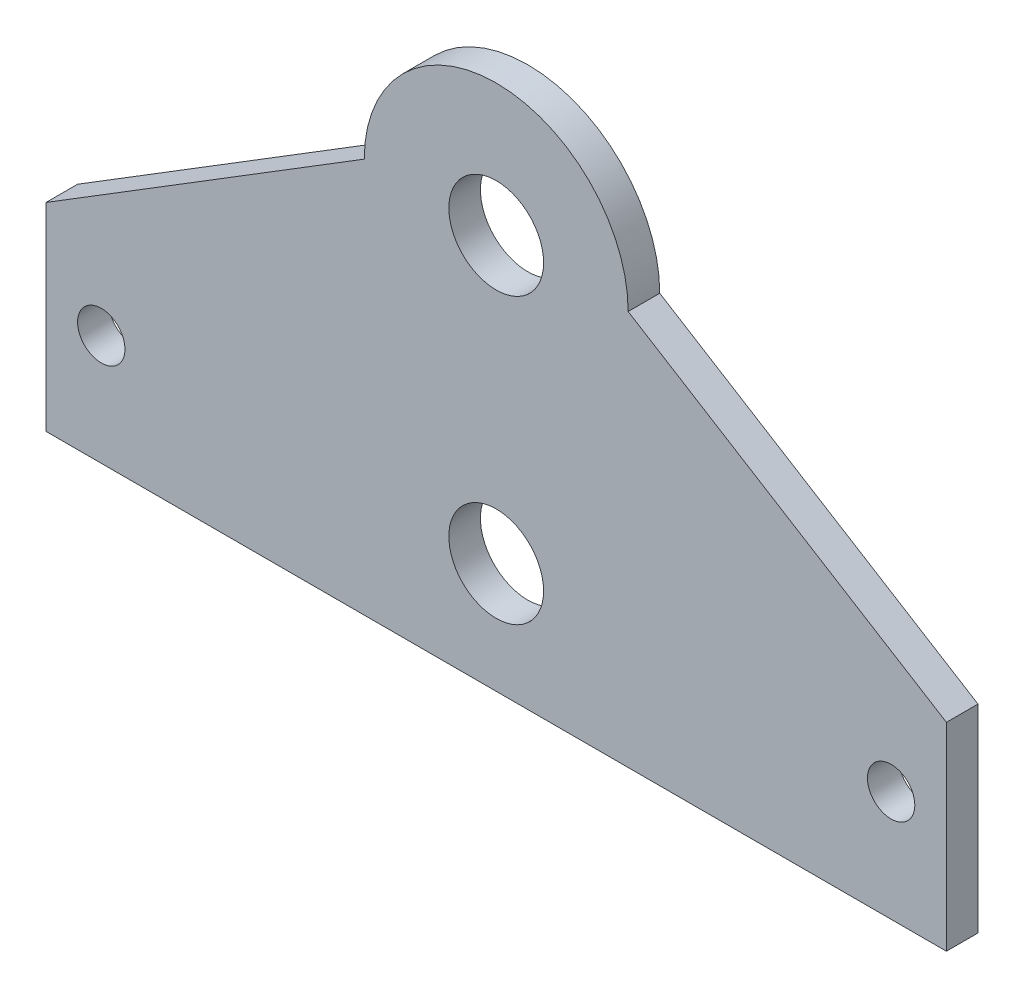
ISO-10303-21;
HEADER;
FILE_DESCRIPTION(('STEP AP214'),'2;1');
FILE_NAME('part.step','',(''),(''),'','','');
FILE_SCHEMA(('AUTOMOTIVE_DESIGN { 1 0 10303 214 1 1 1 1 }'));
ENDSEC;
DATA;
#1=APPLICATION_CONTEXT('core data for automotive mechanical design processes');
#2=APPLICATION_PROTOCOL_DEFINITION('international standard','automotive_design',2000,#1);
#3=PRODUCT_CONTEXT('',#1,'mechanical');
#4=PRODUCT('Part','Part','',(#3));
#5=PRODUCT_RELATED_PRODUCT_CATEGORY('part','',(#4));
#6=PRODUCT_DEFINITION_FORMATION('','',#4);
#7=PRODUCT_DEFINITION_CONTEXT('part definition',#1,'design');
#8=PRODUCT_DEFINITION('design','',#6,#7);
#9=PRODUCT_DEFINITION_SHAPE('','',#8);
#10=(LENGTH_UNIT() NAMED_UNIT(*) SI_UNIT(.MILLI.,.METRE.));
#11=(NAMED_UNIT(*) PLANE_ANGLE_UNIT() SI_UNIT($,.RADIAN.));
#12=(NAMED_UNIT(*) SI_UNIT($,.STERADIAN.) SOLID_ANGLE_UNIT());
#13=UNCERTAINTY_MEASURE_WITH_UNIT(LENGTH_MEASURE(1.E-05),#10,'distance_accuracy_value','');
#14=(GEOMETRIC_REPRESENTATION_CONTEXT(3) GLOBAL_UNCERTAINTY_ASSIGNED_CONTEXT((#13)) GLOBAL_UNIT_ASSIGNED_CONTEXT((#10,
#11,#12)) REPRESENTATION_CONTEXT('',''));
#15=CARTESIAN_POINT('',(0.,0.,0.));
#16=DIRECTION('',(0.,0.,1.));
#17=DIRECTION('',(1.,0.,0.));
#18=AXIS2_PLACEMENT_3D('',#15,#16,#17);
#19=CARTESIAN_POINT('',(15.241142957594,-43.8725999131917,2.));
#20=DIRECTION('',(0.,0.,1.));
#21=DIRECTION('',(1.,0.,0.));
#22=AXIS2_PLACEMENT_3D('',#19,#20,#21);
#23=PLANE('',#22);
#24=CARTESIAN_POINT('',(40.241142957594,-61.8725999131917,2.));
#25=DIRECTION('',(0.,0.,1.));
#26=DIRECTION('',(1.,0.,0.));
#27=AXIS2_PLACEMENT_3D('',#24,#25,#26);
#28=CIRCLE('',#27,1.5);
#29=CARTESIAN_POINT('',(41.7411429575941,-61.8725999131917,2.));
#30=VERTEX_POINT('',#29);
#31=EDGE_CURVE('E189',#30,#30,#28,.T.);
#32=ORIENTED_EDGE('',*,*,#31,.F.);
#33=EDGE_LOOP('',(#32));
#34=FACE_BOUND('',#33,.T.);
#35=CARTESIAN_POINT('',(15.241142957594,-43.8725999131917,2.));
#36=DIRECTION('',(0.,0.,1.));
#37=DIRECTION('',(1.,0.,0.));
#38=AXIS2_PLACEMENT_3D('',#35,#36,#37);
#39=CIRCLE('',#38,3.);
#40=CARTESIAN_POINT('',(18.241142957594,-43.8725999131917,2.));
#41=VERTEX_POINT('',#40);
#42=EDGE_CURVE('E122',#41,#41,#39,.T.);
#43=ORIENTED_EDGE('',*,*,#42,.F.);
#44=EDGE_LOOP('',(#43));
#45=FACE_BOUND('',#44,.T.);
#46=DIRECTION('',(0.,-1.,0.));
#47=VECTOR('',#46,1.);
#48=CARTESIAN_POINT('',(-13.258857042406,-56.3204629170003,2.));
#49=LINE('',#48,#47);
#50=CARTESIAN_POINT('',(-13.258857042406,-56.3204629170003,2.));
#51=VERTEX_POINT('',#50);
#52=CARTESIAN_POINT('',(-13.258857042406,-68.8725999131917,2.));
#53=VERTEX_POINT('',#52);
#54=EDGE_CURVE('E129',#51,#53,#49,.T.);
#55=ORIENTED_EDGE('',*,*,#54,.T.);
#56=DIRECTION('',(1.,0.,0.));
#57=VECTOR('',#56,1.);
#58=CARTESIAN_POINT('',(15.241142957594,-68.8725999131917,2.));
#59=LINE('',#58,#57);
#60=CARTESIAN_POINT('',(43.741142957594,-68.8725999131917,2.));
#61=VERTEX_POINT('',#60);
#62=EDGE_CURVE('E87',#53,#61,#59,.T.);
#63=ORIENTED_EDGE('',*,*,#62,.T.);
#64=DIRECTION('',(0.,1.,0.));
#65=VECTOR('',#64,1.);
#66=CARTESIAN_POINT('',(43.741142957594,-56.3204629170003,2.));
#67=LINE('',#66,#65);
#68=CARTESIAN_POINT('',(43.741142957594,-56.3204629170003,2.));
#69=VERTEX_POINT('',#68);
#70=EDGE_CURVE('E100',#61,#69,#67,.T.);
#71=ORIENTED_EDGE('',*,*,#70,.T.);
#72=DIRECTION('',(-0.850712686374074,0.52563097819878,0.));
#73=VECTOR('',#72,1.);
#74=CARTESIAN_POINT('',(23.5947752304206,-43.8725999131917,2.));
#75=LINE('',#74,#73);
#76=CARTESIAN_POINT('',(23.5947752304206,-43.8725999131917,2.));
#77=VERTEX_POINT('',#76);
#78=EDGE_CURVE('E94',#69,#77,#75,.T.);
#79=ORIENTED_EDGE('',*,*,#78,.T.);
#80=CARTESIAN_POINT('',(15.241142957594,-43.8725999131917,2.));
#81=DIRECTION('',(0.,0.,1.));
#82=DIRECTION('',(1.,0.,0.));
#83=AXIS2_PLACEMENT_3D('',#80,#81,#82);
#84=CIRCLE('',#83,8.35363227282659);
#85=CARTESIAN_POINT('',(6.88751068476745,-43.8725999131917,2.));
#86=VERTEX_POINT('',#85);
#87=EDGE_CURVE('E98',#77,#86,#84,.T.);
#88=ORIENTED_EDGE('',*,*,#87,.T.);
#89=DIRECTION('',(-0.850712686374074,-0.52563097819878,0.));
#90=VECTOR('',#89,1.);
#91=CARTESIAN_POINT('',(6.88751068476745,-43.8725999131917,2.));
#92=LINE('',#91,#90);
#93=EDGE_CURVE('E50',#86,#51,#92,.T.);
#94=ORIENTED_EDGE('',*,*,#93,.T.);
#95=EDGE_LOOP('',(#55,#63,#71,#79,#88,#94));
#96=FACE_BOUND('',#95,.T.);
#97=CARTESIAN_POINT('',(15.241142957594,-61.8725999131917,2.));
#98=DIRECTION('',(0.,0.,1.));
#99=DIRECTION('',(1.,0.,0.));
#100=AXIS2_PLACEMENT_3D('',#97,#98,#99);
#101=CIRCLE('',#100,3.);
#102=CARTESIAN_POINT('',(18.241142957594,-61.8725999131917,2.));
#103=VERTEX_POINT('',#102);
#104=EDGE_CURVE('E195',#103,#103,#101,.T.);
#105=ORIENTED_EDGE('',*,*,#104,.F.);
#106=EDGE_LOOP('',(#105));
#107=FACE_BOUND('',#106,.T.);
#108=CARTESIAN_POINT('',(-9.75885704240595,-61.8725999131917,2.));
#109=DIRECTION('',(0.,0.,1.));
#110=DIRECTION('',(-1.,0.,0.));
#111=AXIS2_PLACEMENT_3D('',#108,#109,#110);
#112=CIRCLE('',#111,1.5);
#113=CARTESIAN_POINT('',(-11.258857042406,-61.8725999131917,2.));
#114=VERTEX_POINT('',#113);
#115=EDGE_CURVE('E180',#114,#114,#112,.T.);
#116=ORIENTED_EDGE('',*,*,#115,.F.);
#117=EDGE_LOOP('',(#116));
#118=FACE_BOUND('',#117,.T.);
#119=ADVANCED_FACE('F33',(#34,#45,#96,#107,#118),#23,.T.);
#120=CARTESIAN_POINT('',(15.241142957594,-43.8725999131917,0.));
#121=DIRECTION('',(0.,0.,1.));
#122=DIRECTION('',(1.,0.,0.));
#123=AXIS2_PLACEMENT_3D('',#120,#121,#122);
#124=PLANE('',#123);
#125=DIRECTION('',(0.,-1.,0.));
#126=VECTOR('',#125,1.);
#127=CARTESIAN_POINT('',(-13.258857042406,-56.3204629170003,0.));
#128=LINE('',#127,#126);
#129=CARTESIAN_POINT('',(-13.258857042406,-56.3204629170003,0.));
#130=VERTEX_POINT('',#129);
#131=CARTESIAN_POINT('',(-13.258857042406,-68.8725999131917,0.));
#132=VERTEX_POINT('',#131);
#133=EDGE_CURVE('E118',#130,#132,#128,.T.);
#134=ORIENTED_EDGE('',*,*,#133,.F.);
#135=DIRECTION('',(-0.850712686374074,-0.52563097819878,0.));
#136=VECTOR('',#135,1.);
#137=CARTESIAN_POINT('',(6.88751068476745,-43.8725999131917,0.));
#138=LINE('',#137,#136);
#139=CARTESIAN_POINT('',(6.88751068476745,-43.8725999131917,0.));
#140=VERTEX_POINT('',#139);
#141=EDGE_CURVE('E79',#140,#130,#138,.T.);
#142=ORIENTED_EDGE('',*,*,#141,.F.);
#143=CARTESIAN_POINT('',(15.241142957594,-43.8725999131917,0.));
#144=DIRECTION('',(0.,0.,1.));
#145=DIRECTION('',(1.,0.,0.));
#146=AXIS2_PLACEMENT_3D('',#143,#144,#145);
#147=CIRCLE('',#146,8.35363227282659);
#148=CARTESIAN_POINT('',(23.5947752304206,-43.8725999131917,0.));
#149=VERTEX_POINT('',#148);
#150=EDGE_CURVE('E73',#149,#140,#147,.T.);
#151=ORIENTED_EDGE('',*,*,#150,.F.);
#152=DIRECTION('',(-0.850712686374074,0.52563097819878,0.));
#153=VECTOR('',#152,1.);
#154=CARTESIAN_POINT('',(23.5947752304206,-43.8725999131917,0.));
#155=LINE('',#154,#153);
#156=CARTESIAN_POINT('',(43.741142957594,-56.3204629170003,0.));
#157=VERTEX_POINT('',#156);
#158=EDGE_CURVE('E108',#157,#149,#155,.T.);
#159=ORIENTED_EDGE('',*,*,#158,.F.);
#160=DIRECTION('',(0.,1.,0.));
#161=VECTOR('',#160,1.);
#162=CARTESIAN_POINT('',(43.741142957594,-56.3204629170003,0.));
#163=LINE('',#162,#161);
#164=CARTESIAN_POINT('',(43.741142957594,-68.8725999131917,0.));
#165=VERTEX_POINT('',#164);
#166=EDGE_CURVE('E124',#165,#157,#163,.T.);
#167=ORIENTED_EDGE('',*,*,#166,.F.);
#168=DIRECTION('',(1.,0.,0.));
#169=VECTOR('',#168,1.);
#170=CARTESIAN_POINT('',(15.241142957594,-68.8725999131917,0.));
#171=LINE('',#170,#169);
#172=EDGE_CURVE('E121',#132,#165,#171,.T.);
#173=ORIENTED_EDGE('',*,*,#172,.F.);
#174=EDGE_LOOP('',(#134,#142,#151,#159,#167,#173));
#175=FACE_BOUND('',#174,.T.);
#176=CARTESIAN_POINT('',(15.241142957594,-43.8725999131917,0.));
#177=DIRECTION('',(0.,0.,1.));
#178=DIRECTION('',(1.,0.,0.));
#179=AXIS2_PLACEMENT_3D('',#176,#177,#178);
#180=CIRCLE('',#179,3.);
#181=CARTESIAN_POINT('',(18.241142957594,-43.8725999131917,0.));
#182=VERTEX_POINT('',#181);
#183=EDGE_CURVE('E198',#182,#182,#180,.T.);
#184=ORIENTED_EDGE('',*,*,#183,.T.);
#185=EDGE_LOOP('',(#184));
#186=FACE_BOUND('',#185,.T.);
#187=CARTESIAN_POINT('',(15.241142957594,-61.8725999131917,0.));
#188=DIRECTION('',(0.,0.,1.));
#189=DIRECTION('',(1.,0.,0.));
#190=AXIS2_PLACEMENT_3D('',#187,#188,#189);
#191=CIRCLE('',#190,3.);
#192=CARTESIAN_POINT('',(18.241142957594,-61.8725999131917,0.));
#193=VERTEX_POINT('',#192);
#194=EDGE_CURVE('E192',#193,#193,#191,.T.);
#195=ORIENTED_EDGE('',*,*,#194,.T.);
#196=EDGE_LOOP('',(#195));
#197=FACE_BOUND('',#196,.T.);
#198=CARTESIAN_POINT('',(40.241142957594,-61.8725999131917,0.));
#199=DIRECTION('',(0.,0.,1.));
#200=DIRECTION('',(1.,0.,0.));
#201=AXIS2_PLACEMENT_3D('',#198,#199,#200);
#202=CIRCLE('',#201,1.5);
#203=CARTESIAN_POINT('',(41.7411429575941,-61.8725999131917,0.));
#204=VERTEX_POINT('',#203);
#205=EDGE_CURVE('E186',#204,#204,#202,.T.);
#206=ORIENTED_EDGE('',*,*,#205,.T.);
#207=EDGE_LOOP('',(#206));
#208=FACE_BOUND('',#207,.T.);
#209=CARTESIAN_POINT('',(-9.75885704240595,-61.8725999131917,0.));
#210=DIRECTION('',(0.,0.,1.));
#211=DIRECTION('',(-1.,0.,0.));
#212=AXIS2_PLACEMENT_3D('',#209,#210,#211);
#213=CIRCLE('',#212,1.5);
#214=CARTESIAN_POINT('',(-11.258857042406,-61.8725999131917,0.));
#215=VERTEX_POINT('',#214);
#216=EDGE_CURVE('E183',#215,#215,#213,.T.);
#217=ORIENTED_EDGE('',*,*,#216,.T.);
#218=EDGE_LOOP('',(#217));
#219=FACE_BOUND('',#218,.T.);
#220=ADVANCED_FACE('F138',(#175,#186,#197,#208,#219),#124,.F.);
#221=CARTESIAN_POINT('',(-13.258857042406,-56.3204629170003,2.));
#222=DIRECTION('',(1.,0.,0.));
#223=DIRECTION('',(0.,0.,-1.));
#224=AXIS2_PLACEMENT_3D('',#221,#222,#223);
#225=PLANE('',#224);
#226=ORIENTED_EDGE('',*,*,#133,.T.);
#227=DIRECTION('',(0.,0.,-1.));
#228=VECTOR('',#227,1.);
#229=CARTESIAN_POINT('',(-13.258857042406,-68.8725999131917,2.));
#230=LINE('',#229,#228);
#231=EDGE_CURVE('E11',#53,#132,#230,.T.);
#232=ORIENTED_EDGE('',*,*,#231,.F.);
#233=ORIENTED_EDGE('',*,*,#54,.F.);
#234=DIRECTION('',(0.,0.,-1.));
#235=VECTOR('',#234,1.);
#236=CARTESIAN_POINT('',(-13.258857042406,-56.3204629170003,2.));
#237=LINE('',#236,#235);
#238=EDGE_CURVE('E114',#51,#130,#237,.T.);
#239=ORIENTED_EDGE('',*,*,#238,.T.);
#240=EDGE_LOOP('',(#226,#232,#233,#239));
#241=FACE_BOUND('',#240,.T.);
#242=ADVANCED_FACE('F35',(#241),#225,.F.);
#243=CARTESIAN_POINT('',(15.241142957594,-68.8725999131917,2.));
#244=DIRECTION('',(0.,1.,0.));
#245=DIRECTION('',(0.,0.,1.));
#246=AXIS2_PLACEMENT_3D('',#243,#244,#245);
#247=PLANE('',#246);
#248=ORIENTED_EDGE('',*,*,#172,.T.);
#249=DIRECTION('',(0.,0.,-1.));
#250=VECTOR('',#249,1.);
#251=CARTESIAN_POINT('',(43.741142957594,-68.8725999131917,2.));
#252=LINE('',#251,#250);
#253=EDGE_CURVE('E42',#61,#165,#252,.T.);
#254=ORIENTED_EDGE('',*,*,#253,.F.);
#255=ORIENTED_EDGE('',*,*,#62,.F.);
#256=ORIENTED_EDGE('',*,*,#231,.T.);
#257=EDGE_LOOP('',(#248,#254,#255,#256));
#258=FACE_BOUND('',#257,.T.);
#259=ADVANCED_FACE('F256',(#258),#247,.F.);
#260=CARTESIAN_POINT('',(43.741142957594,-56.3204629170003,2.));
#261=DIRECTION('',(-1.,0.,0.));
#262=DIRECTION('',(0.,0.,1.));
#263=AXIS2_PLACEMENT_3D('',#260,#261,#262);
#264=PLANE('',#263);
#265=ORIENTED_EDGE('',*,*,#166,.T.);
#266=DIRECTION('',(0.,0.,-1.));
#267=VECTOR('',#266,1.);
#268=CARTESIAN_POINT('',(43.741142957594,-56.3204629170003,2.));
#269=LINE('',#268,#267);
#270=EDGE_CURVE('E109',#69,#157,#269,.T.);
#271=ORIENTED_EDGE('',*,*,#270,.F.);
#272=ORIENTED_EDGE('',*,*,#70,.F.);
#273=ORIENTED_EDGE('',*,*,#253,.T.);
#274=EDGE_LOOP('',(#265,#271,#272,#273));
#275=FACE_BOUND('',#274,.T.);
#276=ADVANCED_FACE('F135',(#275),#264,.F.);
#277=CARTESIAN_POINT('',(23.5947752304206,-43.8725999131917,2.));
#278=DIRECTION('',(-0.52563097819878,-0.850712686374074,0.));
#279=DIRECTION('',(0.850712686374074,-0.52563097819878,0.));
#280=AXIS2_PLACEMENT_3D('',#277,#278,#279);
#281=PLANE('',#280);
#282=ORIENTED_EDGE('',*,*,#158,.T.);
#283=DIRECTION('',(0.,0.,-1.));
#284=VECTOR('',#283,1.);
#285=CARTESIAN_POINT('',(23.5947752304206,-43.8725999131917,2.));
#286=LINE('',#285,#284);
#287=EDGE_CURVE('E105',#77,#149,#286,.T.);
#288=ORIENTED_EDGE('',*,*,#287,.F.);
#289=ORIENTED_EDGE('',*,*,#78,.F.);
#290=ORIENTED_EDGE('',*,*,#270,.T.);
#291=EDGE_LOOP('',(#282,#288,#289,#290));
#292=FACE_BOUND('',#291,.T.);
#293=ADVANCED_FACE('F106',(#292),#281,.F.);
#294=CARTESIAN_POINT('',(15.241142957594,-43.8725999131917,2.));
#295=DIRECTION('',(0.,0.,-1.));
#296=DIRECTION('',(-1.,0.,0.));
#297=AXIS2_PLACEMENT_3D('',#294,#295,#296);
#298=CYLINDRICAL_SURFACE('',#297,8.35363227282659);
#299=ORIENTED_EDGE('',*,*,#150,.T.);
#300=DIRECTION('',(0.,0.,-1.));
#301=VECTOR('',#300,1.);
#302=CARTESIAN_POINT('',(6.88751068476745,-43.8725999131917,2.));
#303=LINE('',#302,#301);
#304=EDGE_CURVE('E110',#86,#140,#303,.T.);
#305=ORIENTED_EDGE('',*,*,#304,.F.);
#306=ORIENTED_EDGE('',*,*,#87,.F.);
#307=ORIENTED_EDGE('',*,*,#287,.T.);
#308=EDGE_LOOP('',(#299,#305,#306,#307));
#309=FACE_BOUND('',#308,.T.);
#310=ADVANCED_FACE('F112',(#309),#298,.T.);
#311=CARTESIAN_POINT('',(6.88751068476745,-43.8725999131917,2.));
#312=DIRECTION('',(0.52563097819878,-0.850712686374074,0.));
#313=DIRECTION('',(0.850712686374074,0.52563097819878,0.));
#314=AXIS2_PLACEMENT_3D('',#311,#312,#313);
#315=PLANE('',#314);
#316=ORIENTED_EDGE('',*,*,#141,.T.);
#317=ORIENTED_EDGE('',*,*,#238,.F.);
#318=ORIENTED_EDGE('',*,*,#93,.F.);
#319=ORIENTED_EDGE('',*,*,#304,.T.);
#320=EDGE_LOOP('',(#316,#317,#318,#319));
#321=FACE_BOUND('',#320,.T.);
#322=ADVANCED_FACE('F143',(#321),#315,.F.);
#323=CARTESIAN_POINT('',(15.241142957594,-43.8725999131917,2.));
#324=DIRECTION('',(0.,0.,-1.));
#325=DIRECTION('',(-1.,0.,0.));
#326=AXIS2_PLACEMENT_3D('',#323,#324,#325);
#327=CYLINDRICAL_SURFACE('',#326,3.);
#328=ORIENTED_EDGE('',*,*,#42,.T.);
#329=EDGE_LOOP('',(#328));
#330=FACE_BOUND('',#329,.T.);
#331=ORIENTED_EDGE('',*,*,#183,.F.);
#332=EDGE_LOOP('',(#331));
#333=FACE_BOUND('',#332,.T.);
#334=ADVANCED_FACE('F145',(#330,#333),#327,.F.);
#335=CARTESIAN_POINT('',(15.241142957594,-61.8725999131917,2.));
#336=DIRECTION('',(0.,0.,-1.));
#337=DIRECTION('',(-1.,0.,0.));
#338=AXIS2_PLACEMENT_3D('',#335,#336,#337);
#339=CYLINDRICAL_SURFACE('',#338,3.);
#340=ORIENTED_EDGE('',*,*,#104,.T.);
#341=EDGE_LOOP('',(#340));
#342=FACE_BOUND('',#341,.T.);
#343=ORIENTED_EDGE('',*,*,#194,.F.);
#344=EDGE_LOOP('',(#343));
#345=FACE_BOUND('',#344,.T.);
#346=ADVANCED_FACE('F151',(#342,#345),#339,.F.);
#347=CARTESIAN_POINT('',(40.241142957594,-61.8725999131917,2.));
#348=DIRECTION('',(0.,0.,-1.));
#349=DIRECTION('',(-1.,0.,0.));
#350=AXIS2_PLACEMENT_3D('',#347,#348,#349);
#351=CYLINDRICAL_SURFACE('',#350,1.5);
#352=ORIENTED_EDGE('',*,*,#31,.T.);
#353=EDGE_LOOP('',(#352));
#354=FACE_BOUND('',#353,.T.);
#355=ORIENTED_EDGE('',*,*,#205,.F.);
#356=EDGE_LOOP('',(#355));
#357=FACE_BOUND('',#356,.T.);
#358=ADVANCED_FACE('F167',(#354,#357),#351,.F.);
#359=CARTESIAN_POINT('',(-9.75885704240595,-61.8725999131917,2.));
#360=DIRECTION('',(0.,0.,-1.));
#361=DIRECTION('',(-1.,0.,0.));
#362=AXIS2_PLACEMENT_3D('',#359,#360,#361);
#363=CYLINDRICAL_SURFACE('',#362,1.5);
#364=ORIENTED_EDGE('',*,*,#115,.T.);
#365=EDGE_LOOP('',(#364));
#366=FACE_BOUND('',#365,.T.);
#367=ORIENTED_EDGE('',*,*,#216,.F.);
#368=EDGE_LOOP('',(#367));
#369=FACE_BOUND('',#368,.T.);
#370=ADVANCED_FACE('F171',(#366,#369),#363,.F.);
#371=CLOSED_SHELL('',(#119,#220,#242,#259,#276,#293,#310,#322,#334,#346,#358,#370));
#372=MANIFOLD_SOLID_BREP('B2',#371);
#373=ADVANCED_BREP_SHAPE_REPRESENTATION('',(#18,#372),#14);
#374=SHAPE_DEFINITION_REPRESENTATION(#9,#373);
ENDSEC;
END-ISO-10303-21;
